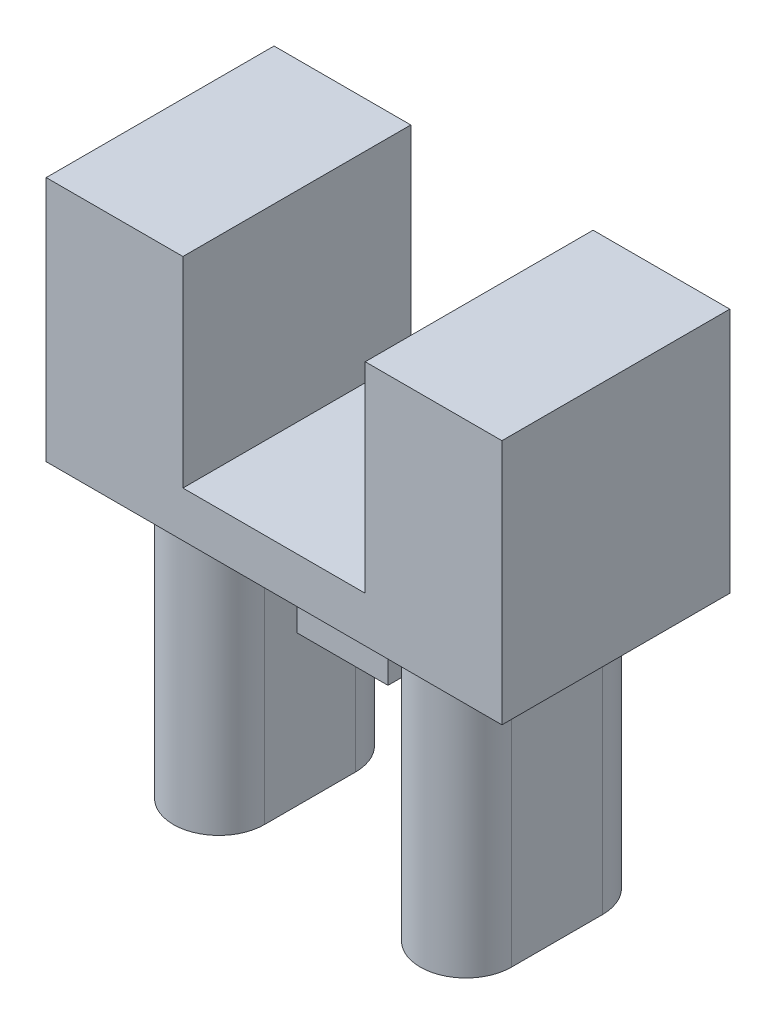
ISO-10303-21;
HEADER;
FILE_DESCRIPTION(('STEP AP214'),'2;1');
FILE_NAME('part.step','',(''),(''),'','','');
FILE_SCHEMA(('AUTOMOTIVE_DESIGN { 1 0 10303 214 1 1 1 1 }'));
ENDSEC;
DATA;
#1=APPLICATION_CONTEXT('core data for automotive mechanical design processes');
#2=APPLICATION_PROTOCOL_DEFINITION('international standard','automotive_design',2000,#1);
#3=PRODUCT_CONTEXT('',#1,'mechanical');
#4=PRODUCT('Part','Part','',(#3));
#5=PRODUCT_RELATED_PRODUCT_CATEGORY('part','',(#4));
#6=PRODUCT_DEFINITION_FORMATION('','',#4);
#7=PRODUCT_DEFINITION_CONTEXT('part definition',#1,'design');
#8=PRODUCT_DEFINITION('design','',#6,#7);
#9=PRODUCT_DEFINITION_SHAPE('','',#8);
#10=(LENGTH_UNIT() NAMED_UNIT(*) SI_UNIT(.MILLI.,.METRE.));
#11=(NAMED_UNIT(*) PLANE_ANGLE_UNIT() SI_UNIT($,.RADIAN.));
#12=(NAMED_UNIT(*) SI_UNIT($,.STERADIAN.) SOLID_ANGLE_UNIT());
#13=UNCERTAINTY_MEASURE_WITH_UNIT(LENGTH_MEASURE(1.E-05),#10,'distance_accuracy_value','');
#14=(GEOMETRIC_REPRESENTATION_CONTEXT(3) GLOBAL_UNCERTAINTY_ASSIGNED_CONTEXT((#13)) GLOBAL_UNIT_ASSIGNED_CONTEXT((#10,
#11,#12)) REPRESENTATION_CONTEXT('',''));
#15=CARTESIAN_POINT('',(0.,0.,0.));
#16=DIRECTION('',(0.,0.,1.));
#17=DIRECTION('',(1.,0.,0.));
#18=AXIS2_PLACEMENT_3D('',#15,#16,#17);
#19=CARTESIAN_POINT('',(6.35,-3.429,6.35));
#20=DIRECTION('',(0.,1.,0.));
#21=DIRECTION('',(-1.,0.,0.));
#22=AXIS2_PLACEMENT_3D('',#19,#20,#21);
#23=PLANE('',#22);
#24=CARTESIAN_POINT('',(-3.44109529760954,-3.429,1.905));
#25=DIRECTION('',(0.,-1.,0.));
#26=DIRECTION('',(1.,0.,0.));
#27=AXIS2_PLACEMENT_3D('',#24,#25,#26);
#28=CIRCLE('',#27,1.27);
#29=CARTESIAN_POINT('',(-4.71109529760954,-3.429,1.905));
#30=VERTEX_POINT('',#29);
#31=CARTESIAN_POINT('',(-2.17109529760954,-3.429,1.905));
#32=VERTEX_POINT('',#31);
#33=EDGE_CURVE('E192',#30,#32,#28,.T.);
#34=ORIENTED_EDGE('',*,*,#33,.F.);
#35=DIRECTION('',(0.,0.,-1.));
#36=VECTOR('',#35,1.);
#37=CARTESIAN_POINT('',(-4.71109529760954,-3.429,1.905));
#38=LINE('',#37,#36);
#39=CARTESIAN_POINT('',(-4.71109529760954,-3.429,4.445));
#40=VERTEX_POINT('',#39);
#41=EDGE_CURVE('E205',#40,#30,#38,.T.);
#42=ORIENTED_EDGE('',*,*,#41,.F.);
#43=CARTESIAN_POINT('',(-3.44109529760954,-3.429,4.445));
#44=DIRECTION('',(0.,-1.,0.));
#45=DIRECTION('',(1.,0.,0.));
#46=AXIS2_PLACEMENT_3D('',#43,#44,#45);
#47=CIRCLE('',#46,1.27);
#48=CARTESIAN_POINT('',(-2.17109529760954,-3.429,4.445));
#49=VERTEX_POINT('',#48);
#50=EDGE_CURVE('E214',#49,#40,#47,.T.);
#51=ORIENTED_EDGE('',*,*,#50,.F.);
#52=DIRECTION('',(0.,0.,1.));
#53=VECTOR('',#52,1.);
#54=CARTESIAN_POINT('',(-2.17109529760954,-3.429,1.905));
#55=LINE('',#54,#53);
#56=EDGE_CURVE('E195',#32,#49,#55,.T.);
#57=ORIENTED_EDGE('',*,*,#56,.F.);
#58=EDGE_LOOP('',(#34,#42,#51,#57));
#59=FACE_BOUND('',#58,.T.);
#60=DIRECTION('',(1.,0.,0.));
#61=VECTOR('',#60,1.);
#62=CARTESIAN_POINT('',(6.35,-3.429,0.));
#63=LINE('',#62,#61);
#64=CARTESIAN_POINT('',(-6.35,-3.429,0.));
#65=VERTEX_POINT('',#64);
#66=CARTESIAN_POINT('',(6.35,-3.429,0.));
#67=VERTEX_POINT('',#66);
#68=EDGE_CURVE('E287',#65,#67,#63,.T.);
#69=ORIENTED_EDGE('',*,*,#68,.T.);
#70=DIRECTION('',(0.,0.,-1.));
#71=VECTOR('',#70,1.);
#72=CARTESIAN_POINT('',(6.35,-3.429,6.35));
#73=LINE('',#72,#71);
#74=CARTESIAN_POINT('',(6.35,-3.429,6.35));
#75=VERTEX_POINT('',#74);
#76=EDGE_CURVE('E312',#75,#67,#73,.T.);
#77=ORIENTED_EDGE('',*,*,#76,.F.);
#78=DIRECTION('',(1.,0.,0.));
#79=VECTOR('',#78,1.);
#80=CARTESIAN_POINT('',(6.35,-3.429,6.35));
#81=LINE('',#80,#79);
#82=CARTESIAN_POINT('',(-6.35,-3.429,6.35));
#83=VERTEX_POINT('',#82);
#84=EDGE_CURVE('E270',#83,#75,#81,.T.);
#85=ORIENTED_EDGE('',*,*,#84,.F.);
#86=DIRECTION('',(0.,0.,-1.));
#87=VECTOR('',#86,1.);
#88=CARTESIAN_POINT('',(-6.35,-3.429,6.35));
#89=LINE('',#88,#87);
#90=EDGE_CURVE('E42',#83,#65,#89,.T.);
#91=ORIENTED_EDGE('',*,*,#90,.T.);
#92=EDGE_LOOP('',(#69,#77,#85,#91));
#93=FACE_BOUND('',#92,.T.);
#94=DIRECTION('',(0.,0.,1.));
#95=VECTOR('',#94,1.);
#96=CARTESIAN_POINT('',(1.27,-3.429,1.905));
#97=LINE('',#96,#95);
#98=CARTESIAN_POINT('',(1.27,-3.429,1.905));
#99=VERTEX_POINT('',#98);
#100=CARTESIAN_POINT('',(1.27,-3.429,4.445));
#101=VERTEX_POINT('',#100);
#102=EDGE_CURVE('E230',#99,#101,#97,.T.);
#103=ORIENTED_EDGE('',*,*,#102,.F.);
#104=DIRECTION('',(1.,0.,0.));
#105=VECTOR('',#104,1.);
#106=CARTESIAN_POINT('',(-1.27,-3.429,1.905));
#107=LINE('',#106,#105);
#108=CARTESIAN_POINT('',(-1.27,-3.429,1.905));
#109=VERTEX_POINT('',#108);
#110=EDGE_CURVE('E235',#109,#99,#107,.T.);
#111=ORIENTED_EDGE('',*,*,#110,.F.);
#112=DIRECTION('',(0.,0.,-1.));
#113=VECTOR('',#112,1.);
#114=CARTESIAN_POINT('',(-1.27,-3.429,1.905));
#115=LINE('',#114,#113);
#116=CARTESIAN_POINT('',(-1.27,-3.429,4.445));
#117=VERTEX_POINT('',#116);
#118=EDGE_CURVE('E247',#117,#109,#115,.T.);
#119=ORIENTED_EDGE('',*,*,#118,.F.);
#120=DIRECTION('',(-1.,0.,0.));
#121=VECTOR('',#120,1.);
#122=CARTESIAN_POINT('',(-1.27,-3.429,4.445));
#123=LINE('',#122,#121);
#124=EDGE_CURVE('E244',#101,#117,#123,.T.);
#125=ORIENTED_EDGE('',*,*,#124,.F.);
#126=EDGE_LOOP('',(#103,#111,#119,#125));
#127=FACE_BOUND('',#126,.T.);
#128=CARTESIAN_POINT('',(3.44109529760953,-3.429,1.90499999999999));
#129=DIRECTION('',(0.,-1.,0.));
#130=DIRECTION('',(-1.,0.,0.));
#131=AXIS2_PLACEMENT_3D('',#128,#129,#130);
#132=CIRCLE('',#131,1.27);
#133=CARTESIAN_POINT('',(2.17109529760953,-3.429,1.905));
#134=VERTEX_POINT('',#133);
#135=CARTESIAN_POINT('',(4.71109529760953,-3.429,1.90499999999999));
#136=VERTEX_POINT('',#135);
#137=EDGE_CURVE('E191',#134,#136,#132,.T.);
#138=ORIENTED_EDGE('',*,*,#137,.F.);
#139=DIRECTION('',(0.,0.,-1.));
#140=VECTOR('',#139,1.);
#141=CARTESIAN_POINT('',(2.17109529760953,-3.429,1.905));
#142=LINE('',#141,#140);
#143=CARTESIAN_POINT('',(2.17109529760954,-3.429,4.445));
#144=VERTEX_POINT('',#143);
#145=EDGE_CURVE('E188',#144,#134,#142,.T.);
#146=ORIENTED_EDGE('',*,*,#145,.F.);
#147=CARTESIAN_POINT('',(3.44109529760954,-3.429,4.445));
#148=DIRECTION('',(0.,-1.,0.));
#149=DIRECTION('',(-1.,0.,0.));
#150=AXIS2_PLACEMENT_3D('',#147,#148,#149);
#151=CIRCLE('',#150,1.27);
#152=CARTESIAN_POINT('',(4.71109529760954,-3.429,4.44499999999999));
#153=VERTEX_POINT('',#152);
#154=EDGE_CURVE('E54',#153,#144,#151,.T.);
#155=ORIENTED_EDGE('',*,*,#154,.F.);
#156=DIRECTION('',(0.,0.,1.));
#157=VECTOR('',#156,1.);
#158=CARTESIAN_POINT('',(4.71109529760953,-3.429,1.90499999999999));
#159=LINE('',#158,#157);
#160=EDGE_CURVE('E49',#136,#153,#159,.T.);
#161=ORIENTED_EDGE('',*,*,#160,.F.);
#162=EDGE_LOOP('',(#138,#146,#155,#161));
#163=FACE_BOUND('',#162,.T.);
#164=ADVANCED_FACE('F34',(#59,#93,#127,#163),#23,.F.);
#165=CARTESIAN_POINT('',(-2.54,3.429,6.35));
#166=DIRECTION('',(0.,-1.,0.));
#167=DIRECTION('',(1.,0.,0.));
#168=AXIS2_PLACEMENT_3D('',#165,#166,#167);
#169=PLANE('',#168);
#170=DIRECTION('',(-1.,0.,0.));
#171=VECTOR('',#170,1.);
#172=CARTESIAN_POINT('',(-2.54,3.429,0.));
#173=LINE('',#172,#171);
#174=CARTESIAN_POINT('',(-2.54,3.429,0.));
#175=VERTEX_POINT('',#174);
#176=CARTESIAN_POINT('',(-6.35,3.429,0.));
#177=VERTEX_POINT('',#176);
#178=EDGE_CURVE('E263',#175,#177,#173,.T.);
#179=ORIENTED_EDGE('',*,*,#178,.T.);
#180=DIRECTION('',(0.,0.,-1.));
#181=VECTOR('',#180,1.);
#182=CARTESIAN_POINT('',(-6.35,3.429,6.35));
#183=LINE('',#182,#181);
#184=CARTESIAN_POINT('',(-6.35,3.429,6.35));
#185=VERTEX_POINT('',#184);
#186=EDGE_CURVE('E11',#185,#177,#183,.T.);
#187=ORIENTED_EDGE('',*,*,#186,.F.);
#188=DIRECTION('',(-1.,0.,0.));
#189=VECTOR('',#188,1.);
#190=CARTESIAN_POINT('',(-2.54,3.429,6.35));
#191=LINE('',#190,#189);
#192=CARTESIAN_POINT('',(-2.54,3.429,6.35));
#193=VERTEX_POINT('',#192);
#194=EDGE_CURVE('E264',#193,#185,#191,.T.);
#195=ORIENTED_EDGE('',*,*,#194,.F.);
#196=DIRECTION('',(0.,0.,-1.));
#197=VECTOR('',#196,1.);
#198=CARTESIAN_POINT('',(-2.54,3.429,6.35));
#199=LINE('',#198,#197);
#200=EDGE_CURVE('E282',#193,#175,#199,.T.);
#201=ORIENTED_EDGE('',*,*,#200,.T.);
#202=EDGE_LOOP('',(#179,#187,#195,#201));
#203=FACE_BOUND('',#202,.T.);
#204=ADVANCED_FACE('F36',(#203),#169,.F.);
#205=CARTESIAN_POINT('',(-6.35,-3.429,6.35));
#206=DIRECTION('',(1.,0.,0.));
#207=DIRECTION('',(0.,0.,-1.));
#208=AXIS2_PLACEMENT_3D('',#205,#206,#207);
#209=PLANE('',#208);
#210=DIRECTION('',(0.,-1.,0.));
#211=VECTOR('',#210,1.);
#212=CARTESIAN_POINT('',(-6.35,-3.429,0.));
#213=LINE('',#212,#211);
#214=EDGE_CURVE('E285',#177,#65,#213,.T.);
#215=ORIENTED_EDGE('',*,*,#214,.T.);
#216=ORIENTED_EDGE('',*,*,#90,.F.);
#217=DIRECTION('',(0.,-1.,0.));
#218=VECTOR('',#217,1.);
#219=CARTESIAN_POINT('',(-6.35,-3.429,6.35));
#220=LINE('',#219,#218);
#221=EDGE_CURVE('E267',#185,#83,#220,.T.);
#222=ORIENTED_EDGE('',*,*,#221,.F.);
#223=ORIENTED_EDGE('',*,*,#186,.T.);
#224=EDGE_LOOP('',(#215,#216,#222,#223));
#225=FACE_BOUND('',#224,.T.);
#226=ADVANCED_FACE('F342',(#225),#209,.F.);
#227=CARTESIAN_POINT('',(6.35,-3.429,6.35));
#228=DIRECTION('',(-1.,0.,0.));
#229=DIRECTION('',(0.,0.,1.));
#230=AXIS2_PLACEMENT_3D('',#227,#228,#229);
#231=PLANE('',#230);
#232=DIRECTION('',(0.,1.,0.));
#233=VECTOR('',#232,1.);
#234=CARTESIAN_POINT('',(6.35,-3.429,0.));
#235=LINE('',#234,#233);
#236=CARTESIAN_POINT('',(6.35,3.429,0.));
#237=VERTEX_POINT('',#236);
#238=EDGE_CURVE('E289',#67,#237,#235,.T.);
#239=ORIENTED_EDGE('',*,*,#238,.T.);
#240=DIRECTION('',(0.,0.,-1.));
#241=VECTOR('',#240,1.);
#242=CARTESIAN_POINT('',(6.35,3.429,6.35));
#243=LINE('',#242,#241);
#244=CARTESIAN_POINT('',(6.35,3.429,6.35));
#245=VERTEX_POINT('',#244);
#246=EDGE_CURVE('E309',#245,#237,#243,.T.);
#247=ORIENTED_EDGE('',*,*,#246,.F.);
#248=DIRECTION('',(0.,1.,0.));
#249=VECTOR('',#248,1.);
#250=CARTESIAN_POINT('',(6.35,-3.429,6.35));
#251=LINE('',#250,#249);
#252=EDGE_CURVE('E272',#75,#245,#251,.T.);
#253=ORIENTED_EDGE('',*,*,#252,.F.);
#254=ORIENTED_EDGE('',*,*,#76,.T.);
#255=EDGE_LOOP('',(#239,#247,#253,#254));
#256=FACE_BOUND('',#255,.T.);
#257=ADVANCED_FACE('F330',(#256),#231,.F.);
#258=CARTESIAN_POINT('',(6.35,3.429,6.35));
#259=DIRECTION('',(0.,-1.,0.));
#260=DIRECTION('',(0.,0.,-1.));
#261=AXIS2_PLACEMENT_3D('',#258,#259,#260);
#262=PLANE('',#261);
#263=DIRECTION('',(-1.,0.,0.));
#264=VECTOR('',#263,1.);
#265=CARTESIAN_POINT('',(6.35,3.429,0.));
#266=LINE('',#265,#264);
#267=CARTESIAN_POINT('',(2.54,3.429,0.));
#268=VERTEX_POINT('',#267);
#269=EDGE_CURVE('E291',#237,#268,#266,.T.);
#270=ORIENTED_EDGE('',*,*,#269,.T.);
#271=DIRECTION('',(0.,0.,-1.));
#272=VECTOR('',#271,1.);
#273=CARTESIAN_POINT('',(2.54,3.429,6.35));
#274=LINE('',#273,#272);
#275=CARTESIAN_POINT('',(2.54,3.429,6.35));
#276=VERTEX_POINT('',#275);
#277=EDGE_CURVE('E306',#276,#268,#274,.T.);
#278=ORIENTED_EDGE('',*,*,#277,.F.);
#279=DIRECTION('',(-1.,0.,0.));
#280=VECTOR('',#279,1.);
#281=CARTESIAN_POINT('',(6.35,3.429,6.35));
#282=LINE('',#281,#280);
#283=EDGE_CURVE('E274',#245,#276,#282,.T.);
#284=ORIENTED_EDGE('',*,*,#283,.F.);
#285=ORIENTED_EDGE('',*,*,#246,.T.);
#286=EDGE_LOOP('',(#270,#278,#284,#285));
#287=FACE_BOUND('',#286,.T.);
#288=ADVANCED_FACE('F334',(#287),#262,.F.);
#289=CARTESIAN_POINT('',(2.54,-2.159,6.35));
#290=DIRECTION('',(1.,0.,0.));
#291=DIRECTION('',(0.,0.,-1.));
#292=AXIS2_PLACEMENT_3D('',#289,#290,#291);
#293=PLANE('',#292);
#294=DIRECTION('',(0.,-1.,0.));
#295=VECTOR('',#294,1.);
#296=CARTESIAN_POINT('',(2.54,-2.159,0.));
#297=LINE('',#296,#295);
#298=CARTESIAN_POINT('',(2.54,-2.159,0.));
#299=VERTEX_POINT('',#298);
#300=EDGE_CURVE('E293',#268,#299,#297,.T.);
#301=ORIENTED_EDGE('',*,*,#300,.T.);
#302=DIRECTION('',(0.,0.,-1.));
#303=VECTOR('',#302,1.);
#304=CARTESIAN_POINT('',(2.54,-2.159,6.35));
#305=LINE('',#304,#303);
#306=CARTESIAN_POINT('',(2.54,-2.159,6.35));
#307=VERTEX_POINT('',#306);
#308=EDGE_CURVE('E303',#307,#299,#305,.T.);
#309=ORIENTED_EDGE('',*,*,#308,.F.);
#310=DIRECTION('',(0.,-1.,0.));
#311=VECTOR('',#310,1.);
#312=CARTESIAN_POINT('',(2.54,-2.159,6.35));
#313=LINE('',#312,#311);
#314=EDGE_CURVE('E276',#276,#307,#313,.T.);
#315=ORIENTED_EDGE('',*,*,#314,.F.);
#316=ORIENTED_EDGE('',*,*,#277,.T.);
#317=EDGE_LOOP('',(#301,#309,#315,#316));
#318=FACE_BOUND('',#317,.T.);
#319=ADVANCED_FACE('F355',(#318),#293,.F.);
#320=CARTESIAN_POINT('',(2.54,-2.159,6.35));
#321=DIRECTION('',(0.,-1.,0.));
#322=DIRECTION('',(1.,0.,0.));
#323=AXIS2_PLACEMENT_3D('',#320,#321,#322);
#324=PLANE('',#323);
#325=DIRECTION('',(-1.,0.,0.));
#326=VECTOR('',#325,1.);
#327=CARTESIAN_POINT('',(2.54,-2.159,0.));
#328=LINE('',#327,#326);
#329=CARTESIAN_POINT('',(-2.54,-2.159,0.));
#330=VERTEX_POINT('',#329);
#331=EDGE_CURVE('E295',#299,#330,#328,.T.);
#332=ORIENTED_EDGE('',*,*,#331,.T.);
#333=DIRECTION('',(0.,0.,-1.));
#334=VECTOR('',#333,1.);
#335=CARTESIAN_POINT('',(-2.54,-2.159,6.35));
#336=LINE('',#335,#334);
#337=CARTESIAN_POINT('',(-2.54,-2.159,6.35));
#338=VERTEX_POINT('',#337);
#339=EDGE_CURVE('E300',#338,#330,#336,.T.);
#340=ORIENTED_EDGE('',*,*,#339,.F.);
#341=DIRECTION('',(-1.,0.,0.));
#342=VECTOR('',#341,1.);
#343=CARTESIAN_POINT('',(2.54,-2.159,6.35));
#344=LINE('',#343,#342);
#345=EDGE_CURVE('E278',#307,#338,#344,.T.);
#346=ORIENTED_EDGE('',*,*,#345,.F.);
#347=ORIENTED_EDGE('',*,*,#308,.T.);
#348=EDGE_LOOP('',(#332,#340,#346,#347));
#349=FACE_BOUND('',#348,.T.);
#350=ADVANCED_FACE('F353',(#349),#324,.F.);
#351=CARTESIAN_POINT('',(-2.54,-2.159,6.35));
#352=DIRECTION('',(-1.,0.,0.));
#353=DIRECTION('',(0.,0.,1.));
#354=AXIS2_PLACEMENT_3D('',#351,#352,#353);
#355=PLANE('',#354);
#356=DIRECTION('',(0.,1.,0.));
#357=VECTOR('',#356,1.);
#358=CARTESIAN_POINT('',(-2.54,-2.159,0.));
#359=LINE('',#358,#357);
#360=EDGE_CURVE('E268',#330,#175,#359,.T.);
#361=ORIENTED_EDGE('',*,*,#360,.T.);
#362=ORIENTED_EDGE('',*,*,#200,.F.);
#363=DIRECTION('',(0.,1.,0.));
#364=VECTOR('',#363,1.);
#365=CARTESIAN_POINT('',(-2.54,-2.159,6.35));
#366=LINE('',#365,#364);
#367=EDGE_CURVE('E280',#338,#193,#366,.T.);
#368=ORIENTED_EDGE('',*,*,#367,.F.);
#369=ORIENTED_EDGE('',*,*,#339,.T.);
#370=EDGE_LOOP('',(#361,#362,#368,#369));
#371=FACE_BOUND('',#370,.T.);
#372=ADVANCED_FACE('F348',(#371),#355,.F.);
#373=CARTESIAN_POINT('',(0.,0.,6.35));
#374=DIRECTION('',(0.,0.,-1.));
#375=DIRECTION('',(-1.,0.,0.));
#376=AXIS2_PLACEMENT_3D('',#373,#374,#375);
#377=PLANE('',#376);
#378=ORIENTED_EDGE('',*,*,#194,.T.);
#379=ORIENTED_EDGE('',*,*,#221,.T.);
#380=ORIENTED_EDGE('',*,*,#84,.T.);
#381=ORIENTED_EDGE('',*,*,#252,.T.);
#382=ORIENTED_EDGE('',*,*,#283,.T.);
#383=ORIENTED_EDGE('',*,*,#314,.T.);
#384=ORIENTED_EDGE('',*,*,#345,.T.);
#385=ORIENTED_EDGE('',*,*,#367,.T.);
#386=EDGE_LOOP('',(#378,#379,#380,#381,#382,#383,#384,#385));
#387=FACE_BOUND('',#386,.T.);
#388=ADVANCED_FACE('F338',(#387),#377,.F.);
#389=CARTESIAN_POINT('',(0.,0.,0.));
#390=DIRECTION('',(0.,0.,-1.));
#391=DIRECTION('',(-1.,0.,0.));
#392=AXIS2_PLACEMENT_3D('',#389,#390,#391);
#393=PLANE('',#392);
#394=ORIENTED_EDGE('',*,*,#178,.F.);
#395=ORIENTED_EDGE('',*,*,#360,.F.);
#396=ORIENTED_EDGE('',*,*,#331,.F.);
#397=ORIENTED_EDGE('',*,*,#300,.F.);
#398=ORIENTED_EDGE('',*,*,#269,.F.);
#399=ORIENTED_EDGE('',*,*,#238,.F.);
#400=ORIENTED_EDGE('',*,*,#68,.F.);
#401=ORIENTED_EDGE('',*,*,#214,.F.);
#402=EDGE_LOOP('',(#394,#395,#396,#397,#398,#399,#400,#401));
#403=FACE_BOUND('',#402,.T.);
#404=ADVANCED_FACE('F325',(#403),#393,.T.);
#405=CARTESIAN_POINT('',(1.27,-5.969,1.905));
#406=DIRECTION('',(-1.,0.,0.));
#407=DIRECTION('',(0.,-1.,0.));
#408=AXIS2_PLACEMENT_3D('',#405,#406,#407);
#409=PLANE('',#408);
#410=ORIENTED_EDGE('',*,*,#102,.T.);
#411=DIRECTION('',(0.,1.,0.));
#412=VECTOR('',#411,1.);
#413=CARTESIAN_POINT('',(1.27,-5.969,4.445));
#414=LINE('',#413,#412);
#415=CARTESIAN_POINT('',(1.27,-5.969,4.445));
#416=VERTEX_POINT('',#415);
#417=EDGE_CURVE('E260',#416,#101,#414,.T.);
#418=ORIENTED_EDGE('',*,*,#417,.F.);
#419=DIRECTION('',(0.,0.,1.));
#420=VECTOR('',#419,1.);
#421=CARTESIAN_POINT('',(1.27,-5.969,1.905));
#422=LINE('',#421,#420);
#423=CARTESIAN_POINT('',(1.27,-5.969,1.905));
#424=VERTEX_POINT('',#423);
#425=EDGE_CURVE('E231',#424,#416,#422,.T.);
#426=ORIENTED_EDGE('',*,*,#425,.F.);
#427=DIRECTION('',(0.,1.,0.));
#428=VECTOR('',#427,1.);
#429=CARTESIAN_POINT('',(1.27,-5.969,1.905));
#430=LINE('',#429,#428);
#431=EDGE_CURVE('E241',#424,#99,#430,.T.);
#432=ORIENTED_EDGE('',*,*,#431,.T.);
#433=EDGE_LOOP('',(#410,#418,#426,#432));
#434=FACE_BOUND('',#433,.T.);
#435=ADVANCED_FACE('F418',(#434),#409,.F.);
#436=CARTESIAN_POINT('',(-1.27,-5.969,4.445));
#437=DIRECTION('',(0.,0.,-1.));
#438=DIRECTION('',(-1.,0.,0.));
#439=AXIS2_PLACEMENT_3D('',#436,#437,#438);
#440=PLANE('',#439);
#441=ORIENTED_EDGE('',*,*,#124,.T.);
#442=DIRECTION('',(0.,1.,0.));
#443=VECTOR('',#442,1.);
#444=CARTESIAN_POINT('',(-1.27,-5.969,4.445));
#445=LINE('',#444,#443);
#446=CARTESIAN_POINT('',(-1.27,-5.969,4.445));
#447=VERTEX_POINT('',#446);
#448=EDGE_CURVE('E257',#447,#117,#445,.T.);
#449=ORIENTED_EDGE('',*,*,#448,.F.);
#450=DIRECTION('',(-1.,0.,0.));
#451=VECTOR('',#450,1.);
#452=CARTESIAN_POINT('',(-1.27,-5.969,4.445));
#453=LINE('',#452,#451);
#454=EDGE_CURVE('E234',#416,#447,#453,.T.);
#455=ORIENTED_EDGE('',*,*,#454,.F.);
#456=ORIENTED_EDGE('',*,*,#417,.T.);
#457=EDGE_LOOP('',(#441,#449,#455,#456));
#458=FACE_BOUND('',#457,.T.);
#459=ADVANCED_FACE('F427',(#458),#440,.F.);
#460=CARTESIAN_POINT('',(-1.27,-5.969,1.905));
#461=DIRECTION('',(1.,0.,0.));
#462=DIRECTION('',(0.,1.,0.));
#463=AXIS2_PLACEMENT_3D('',#460,#461,#462);
#464=PLANE('',#463);
#465=ORIENTED_EDGE('',*,*,#118,.T.);
#466=DIRECTION('',(0.,1.,0.));
#467=VECTOR('',#466,1.);
#468=CARTESIAN_POINT('',(-1.27,-5.969,1.905));
#469=LINE('',#468,#467);
#470=CARTESIAN_POINT('',(-1.27,-5.969,1.905));
#471=VERTEX_POINT('',#470);
#472=EDGE_CURVE('E254',#471,#109,#469,.T.);
#473=ORIENTED_EDGE('',*,*,#472,.F.);
#474=DIRECTION('',(0.,0.,-1.));
#475=VECTOR('',#474,1.);
#476=CARTESIAN_POINT('',(-1.27,-5.969,1.905));
#477=LINE('',#476,#475);
#478=EDGE_CURVE('E237',#447,#471,#477,.T.);
#479=ORIENTED_EDGE('',*,*,#478,.F.);
#480=ORIENTED_EDGE('',*,*,#448,.T.);
#481=EDGE_LOOP('',(#465,#473,#479,#480));
#482=FACE_BOUND('',#481,.T.);
#483=ADVANCED_FACE('F437',(#482),#464,.F.);
#484=CARTESIAN_POINT('',(-1.27,-5.969,1.905));
#485=DIRECTION('',(0.,0.,1.));
#486=DIRECTION('',(1.,0.,0.));
#487=AXIS2_PLACEMENT_3D('',#484,#485,#486);
#488=PLANE('',#487);
#489=ORIENTED_EDGE('',*,*,#110,.T.);
#490=ORIENTED_EDGE('',*,*,#431,.F.);
#491=DIRECTION('',(1.,0.,0.));
#492=VECTOR('',#491,1.);
#493=CARTESIAN_POINT('',(-1.27,-5.969,1.905));
#494=LINE('',#493,#492);
#495=EDGE_CURVE('E239',#471,#424,#494,.T.);
#496=ORIENTED_EDGE('',*,*,#495,.F.);
#497=ORIENTED_EDGE('',*,*,#472,.T.);
#498=EDGE_LOOP('',(#489,#490,#496,#497));
#499=FACE_BOUND('',#498,.T.);
#500=ADVANCED_FACE('F447',(#499),#488,.F.);
#501=CARTESIAN_POINT('',(0.,-5.969,0.));
#502=DIRECTION('',(0.,1.,0.));
#503=DIRECTION('',(0.,0.,1.));
#504=AXIS2_PLACEMENT_3D('',#501,#502,#503);
#505=PLANE('',#504);
#506=ORIENTED_EDGE('',*,*,#425,.T.);
#507=ORIENTED_EDGE('',*,*,#454,.T.);
#508=ORIENTED_EDGE('',*,*,#478,.T.);
#509=ORIENTED_EDGE('',*,*,#495,.T.);
#510=EDGE_LOOP('',(#506,#507,#508,#509));
#511=FACE_BOUND('',#510,.T.);
#512=ADVANCED_FACE('F456',(#511),#505,.F.);
#513=CARTESIAN_POINT('',(-3.44109529760954,-11.049,1.905));
#514=DIRECTION('',(0.,1.,0.));
#515=DIRECTION('',(-1.,0.,0.));
#516=AXIS2_PLACEMENT_3D('',#513,#514,#515);
#517=CYLINDRICAL_SURFACE('',#516,1.27);
#518=ORIENTED_EDGE('',*,*,#33,.T.);
#519=DIRECTION('',(0.,1.,0.));
#520=VECTOR('',#519,1.);
#521=CARTESIAN_POINT('',(-2.17109529760954,-11.049,1.905));
#522=LINE('',#521,#520);
#523=CARTESIAN_POINT('',(-2.17109529760954,-11.049,1.905));
#524=VERTEX_POINT('',#523);
#525=EDGE_CURVE('E227',#524,#32,#522,.T.);
#526=ORIENTED_EDGE('',*,*,#525,.F.);
#527=CARTESIAN_POINT('',(-3.44109529760954,-11.049,1.905));
#528=DIRECTION('',(0.,-1.,0.));
#529=DIRECTION('',(1.,0.,0.));
#530=AXIS2_PLACEMENT_3D('',#527,#528,#529);
#531=CIRCLE('',#530,1.27);
#532=CARTESIAN_POINT('',(-4.71109529760954,-11.049,1.905));
#533=VERTEX_POINT('',#532);
#534=EDGE_CURVE('E201',#533,#524,#531,.T.);
#535=ORIENTED_EDGE('',*,*,#534,.F.);
#536=DIRECTION('',(0.,1.,0.));
#537=VECTOR('',#536,1.);
#538=CARTESIAN_POINT('',(-4.71109529760954,-11.049,1.905));
#539=LINE('',#538,#537);
#540=EDGE_CURVE('E210',#533,#30,#539,.T.);
#541=ORIENTED_EDGE('',*,*,#540,.T.);
#542=EDGE_LOOP('',(#518,#526,#535,#541));
#543=FACE_BOUND('',#542,.T.);
#544=ADVANCED_FACE('F465',(#543),#517,.T.);
#545=CARTESIAN_POINT('',(-2.17109529760954,-11.049,1.905));
#546=DIRECTION('',(-1.,0.,0.));
#547=DIRECTION('',(0.,0.,1.));
#548=AXIS2_PLACEMENT_3D('',#545,#546,#547);
#549=PLANE('',#548);
#550=ORIENTED_EDGE('',*,*,#56,.T.);
#551=DIRECTION('',(0.,1.,0.));
#552=VECTOR('',#551,1.);
#553=CARTESIAN_POINT('',(-2.17109529760954,-11.049,4.445));
#554=LINE('',#553,#552);
#555=CARTESIAN_POINT('',(-2.17109529760954,-11.049,4.445));
#556=VERTEX_POINT('',#555);
#557=EDGE_CURVE('E224',#556,#49,#554,.T.);
#558=ORIENTED_EDGE('',*,*,#557,.F.);
#559=DIRECTION('',(0.,0.,1.));
#560=VECTOR('',#559,1.);
#561=CARTESIAN_POINT('',(-2.17109529760954,-11.049,1.905));
#562=LINE('',#561,#560);
#563=EDGE_CURVE('E204',#524,#556,#562,.T.);
#564=ORIENTED_EDGE('',*,*,#563,.F.);
#565=ORIENTED_EDGE('',*,*,#525,.T.);
#566=EDGE_LOOP('',(#550,#558,#564,#565));
#567=FACE_BOUND('',#566,.T.);
#568=ADVANCED_FACE('F479',(#567),#549,.F.);
#569=CARTESIAN_POINT('',(-3.44109529760954,-11.049,4.445));
#570=DIRECTION('',(0.,1.,0.));
#571=DIRECTION('',(-1.,0.,0.));
#572=AXIS2_PLACEMENT_3D('',#569,#570,#571);
#573=CYLINDRICAL_SURFACE('',#572,1.27);
#574=ORIENTED_EDGE('',*,*,#50,.T.);
#575=DIRECTION('',(0.,1.,0.));
#576=VECTOR('',#575,1.);
#577=CARTESIAN_POINT('',(-4.71109529760954,-11.049,4.445));
#578=LINE('',#577,#576);
#579=CARTESIAN_POINT('',(-4.71109529760954,-11.049,4.445));
#580=VERTEX_POINT('',#579);
#581=EDGE_CURVE('E221',#580,#40,#578,.T.);
#582=ORIENTED_EDGE('',*,*,#581,.F.);
#583=CARTESIAN_POINT('',(-3.44109529760954,-11.049,4.445));
#584=DIRECTION('',(0.,-1.,0.));
#585=DIRECTION('',(1.,0.,0.));
#586=AXIS2_PLACEMENT_3D('',#583,#584,#585);
#587=CIRCLE('',#586,1.27);
#588=EDGE_CURVE('E207',#556,#580,#587,.T.);
#589=ORIENTED_EDGE('',*,*,#588,.F.);
#590=ORIENTED_EDGE('',*,*,#557,.T.);
#591=EDGE_LOOP('',(#574,#582,#589,#590));
#592=FACE_BOUND('',#591,.T.);
#593=ADVANCED_FACE('F486',(#592),#573,.T.);
#594=CARTESIAN_POINT('',(-4.71109529760954,-11.049,1.905));
#595=DIRECTION('',(1.,0.,0.));
#596=DIRECTION('',(0.,1.,0.));
#597=AXIS2_PLACEMENT_3D('',#594,#595,#596);
#598=PLANE('',#597);
#599=ORIENTED_EDGE('',*,*,#41,.T.);
#600=ORIENTED_EDGE('',*,*,#540,.F.);
#601=DIRECTION('',(0.,0.,-1.));
#602=VECTOR('',#601,1.);
#603=CARTESIAN_POINT('',(-4.71109529760954,-11.049,1.905));
#604=LINE('',#603,#602);
#605=EDGE_CURVE('E209',#580,#533,#604,.T.);
#606=ORIENTED_EDGE('',*,*,#605,.F.);
#607=ORIENTED_EDGE('',*,*,#581,.T.);
#608=EDGE_LOOP('',(#599,#600,#606,#607));
#609=FACE_BOUND('',#608,.T.);
#610=ADVANCED_FACE('F494',(#609),#598,.F.);
#611=CARTESIAN_POINT('',(-3.44109529760954,-11.049,1.905));
#612=DIRECTION('',(0.,-1.,0.));
#613=DIRECTION('',(1.,0.,0.));
#614=AXIS2_PLACEMENT_3D('',#611,#612,#613);
#615=PLANE('',#614);
#616=ORIENTED_EDGE('',*,*,#534,.T.);
#617=ORIENTED_EDGE('',*,*,#563,.T.);
#618=ORIENTED_EDGE('',*,*,#588,.T.);
#619=ORIENTED_EDGE('',*,*,#605,.T.);
#620=EDGE_LOOP('',(#616,#617,#618,#619));
#621=FACE_BOUND('',#620,.T.);
#622=ADVANCED_FACE('F502',(#621),#615,.T.);
#623=CARTESIAN_POINT('',(3.44109529760953,-11.049,1.90499999999999));
#624=DIRECTION('',(0.,1.,0.));
#625=DIRECTION('',(-1.,0.,0.));
#626=AXIS2_PLACEMENT_3D('',#623,#624,#625);
#627=CYLINDRICAL_SURFACE('',#626,1.27);
#628=ORIENTED_EDGE('',*,*,#137,.T.);
#629=DIRECTION('',(0.,1.,0.));
#630=VECTOR('',#629,1.);
#631=CARTESIAN_POINT('',(4.71109529760953,-11.049,1.90499999999999));
#632=LINE('',#631,#630);
#633=CARTESIAN_POINT('',(4.71109529760953,-11.049,1.90499999999999));
#634=VERTEX_POINT('',#633);
#635=EDGE_CURVE('E172',#634,#136,#632,.T.);
#636=ORIENTED_EDGE('',*,*,#635,.F.);
#637=CARTESIAN_POINT('',(3.44109529760953,-11.049,1.90499999999999));
#638=DIRECTION('',(0.,-1.,0.));
#639=DIRECTION('',(-1.,0.,0.));
#640=AXIS2_PLACEMENT_3D('',#637,#638,#639);
#641=CIRCLE('',#640,1.27);
#642=CARTESIAN_POINT('',(2.17109529760953,-11.049,1.905));
#643=VERTEX_POINT('',#642);
#644=EDGE_CURVE('E179',#643,#634,#641,.T.);
#645=ORIENTED_EDGE('',*,*,#644,.F.);
#646=DIRECTION('',(0.,1.,0.));
#647=VECTOR('',#646,1.);
#648=CARTESIAN_POINT('',(2.17109529760953,-11.049,1.905));
#649=LINE('',#648,#647);
#650=EDGE_CURVE('E569',#643,#134,#649,.T.);
#651=ORIENTED_EDGE('',*,*,#650,.T.);
#652=EDGE_LOOP('',(#628,#636,#645,#651));
#653=FACE_BOUND('',#652,.T.);
#654=ADVANCED_FACE('F190',(#653),#627,.T.);
#655=CARTESIAN_POINT('',(4.71109529760953,-11.049,1.90499999999999));
#656=DIRECTION('',(-1.,0.,0.));
#657=DIRECTION('',(0.,0.,1.));
#658=AXIS2_PLACEMENT_3D('',#655,#656,#657);
#659=PLANE('',#658);
#660=ORIENTED_EDGE('',*,*,#160,.T.);
#661=DIRECTION('',(0.,1.,0.));
#662=VECTOR('',#661,1.);
#663=CARTESIAN_POINT('',(4.71109529760954,-11.049,4.44499999999999));
#664=LINE('',#663,#662);
#665=CARTESIAN_POINT('',(4.71109529760954,-11.049,4.44499999999999));
#666=VERTEX_POINT('',#665);
#667=EDGE_CURVE('E175',#666,#153,#664,.T.);
#668=ORIENTED_EDGE('',*,*,#667,.F.);
#669=DIRECTION('',(0.,0.,1.));
#670=VECTOR('',#669,1.);
#671=CARTESIAN_POINT('',(4.71109529760953,-11.049,1.90499999999999));
#672=LINE('',#671,#670);
#673=EDGE_CURVE('E168',#634,#666,#672,.T.);
#674=ORIENTED_EDGE('',*,*,#673,.F.);
#675=ORIENTED_EDGE('',*,*,#635,.T.);
#676=EDGE_LOOP('',(#660,#668,#674,#675));
#677=FACE_BOUND('',#676,.T.);
#678=ADVANCED_FACE('F170',(#677),#659,.F.);
#679=CARTESIAN_POINT('',(3.44109529760954,-11.049,4.445));
#680=DIRECTION('',(0.,1.,0.));
#681=DIRECTION('',(-1.,0.,0.));
#682=AXIS2_PLACEMENT_3D('',#679,#680,#681);
#683=CYLINDRICAL_SURFACE('',#682,1.27);
#684=ORIENTED_EDGE('',*,*,#154,.T.);
#685=DIRECTION('',(0.,1.,0.));
#686=VECTOR('',#685,1.);
#687=CARTESIAN_POINT('',(2.17109529760954,-11.049,4.445));
#688=LINE('',#687,#686);
#689=CARTESIAN_POINT('',(2.17109529760954,-11.049,4.445));
#690=VERTEX_POINT('',#689);
#691=EDGE_CURVE('E197',#690,#144,#688,.T.);
#692=ORIENTED_EDGE('',*,*,#691,.F.);
#693=CARTESIAN_POINT('',(3.44109529760954,-11.049,4.445));
#694=DIRECTION('',(0.,-1.,0.));
#695=DIRECTION('',(-1.,0.,0.));
#696=AXIS2_PLACEMENT_3D('',#693,#694,#695);
#697=CIRCLE('',#696,1.27);
#698=EDGE_CURVE('E178',#666,#690,#697,.T.);
#699=ORIENTED_EDGE('',*,*,#698,.F.);
#700=ORIENTED_EDGE('',*,*,#667,.T.);
#701=EDGE_LOOP('',(#684,#692,#699,#700));
#702=FACE_BOUND('',#701,.T.);
#703=ADVANCED_FACE('F523',(#702),#683,.T.);
#704=CARTESIAN_POINT('',(2.17109529760953,-11.049,1.905));
#705=DIRECTION('',(1.,0.,0.));
#706=DIRECTION('',(0.,0.,-1.));
#707=AXIS2_PLACEMENT_3D('',#704,#705,#706);
#708=PLANE('',#707);
#709=ORIENTED_EDGE('',*,*,#145,.T.);
#710=ORIENTED_EDGE('',*,*,#650,.F.);
#711=DIRECTION('',(0.,0.,-1.));
#712=VECTOR('',#711,1.);
#713=CARTESIAN_POINT('',(2.17109529760953,-11.049,1.905));
#714=LINE('',#713,#712);
#715=EDGE_CURVE('E184',#690,#643,#714,.T.);
#716=ORIENTED_EDGE('',*,*,#715,.F.);
#717=ORIENTED_EDGE('',*,*,#691,.T.);
#718=EDGE_LOOP('',(#709,#710,#716,#717));
#719=FACE_BOUND('',#718,.T.);
#720=ADVANCED_FACE('F530',(#719),#708,.F.);
#721=CARTESIAN_POINT('',(3.44109529760953,-11.049,1.90499999999999));
#722=DIRECTION('',(0.,1.,0.));
#723=DIRECTION('',(-1.,0.,0.));
#724=AXIS2_PLACEMENT_3D('',#721,#722,#723);
#725=PLANE('',#724);
#726=ORIENTED_EDGE('',*,*,#644,.T.);
#727=ORIENTED_EDGE('',*,*,#673,.T.);
#728=ORIENTED_EDGE('',*,*,#698,.T.);
#729=ORIENTED_EDGE('',*,*,#715,.T.);
#730=EDGE_LOOP('',(#726,#727,#728,#729));
#731=FACE_BOUND('',#730,.T.);
#732=ADVANCED_FACE('F182',(#731),#725,.F.);
#733=CLOSED_SHELL('',(#164,#204,#226,#257,#288,#319,#350,#372,#388,#404,#435,#459,#483,#500,
#512,#544,#568,#593,#610,#622,#654,#678,#703,#720,#732));
#734=MANIFOLD_SOLID_BREP('B2',#733);
#735=ADVANCED_BREP_SHAPE_REPRESENTATION('',(#18,#734),#14);
#736=SHAPE_DEFINITION_REPRESENTATION(#9,#735);
ENDSEC;
END-ISO-10303-21;
